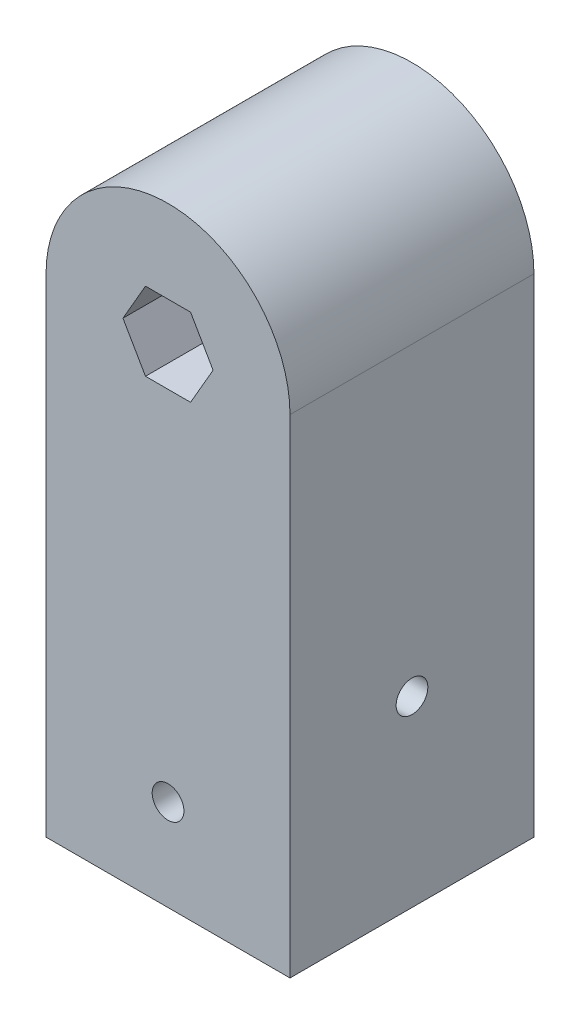
ISO-10303-21;
HEADER;
FILE_DESCRIPTION(('STEP AP214'),'2;1');
FILE_NAME('part.step','',(''),(''),'','','');
FILE_SCHEMA(('AUTOMOTIVE_DESIGN { 1 0 10303 214 1 1 1 1 }'));
ENDSEC;
DATA;
#1=APPLICATION_CONTEXT('core data for automotive mechanical design processes');
#2=APPLICATION_PROTOCOL_DEFINITION('international standard','automotive_design',2000,#1);
#3=PRODUCT_CONTEXT('',#1,'mechanical');
#4=PRODUCT('Part','Part','',(#3));
#5=PRODUCT_RELATED_PRODUCT_CATEGORY('part','',(#4));
#6=PRODUCT_DEFINITION_FORMATION('','',#4);
#7=PRODUCT_DEFINITION_CONTEXT('part definition',#1,'design');
#8=PRODUCT_DEFINITION('design','',#6,#7);
#9=PRODUCT_DEFINITION_SHAPE('','',#8);
#10=(LENGTH_UNIT() NAMED_UNIT(*) SI_UNIT(.MILLI.,.METRE.));
#11=(NAMED_UNIT(*) PLANE_ANGLE_UNIT() SI_UNIT($,.RADIAN.));
#12=(NAMED_UNIT(*) SI_UNIT($,.STERADIAN.) SOLID_ANGLE_UNIT());
#13=UNCERTAINTY_MEASURE_WITH_UNIT(LENGTH_MEASURE(1.E-05),#10,'distance_accuracy_value','');
#14=(GEOMETRIC_REPRESENTATION_CONTEXT(3) GLOBAL_UNCERTAINTY_ASSIGNED_CONTEXT((#13)) GLOBAL_UNIT_ASSIGNED_CONTEXT((#10,
#11,#12)) REPRESENTATION_CONTEXT('',''));
#15=CARTESIAN_POINT('',(0.,0.,0.));
#16=DIRECTION('',(0.,0.,1.));
#17=DIRECTION('',(1.,0.,0.));
#18=AXIS2_PLACEMENT_3D('',#15,#16,#17);
#19=CARTESIAN_POINT('',(0.,0.,10.));
#20=DIRECTION('',(0.,0.,1.));
#21=DIRECTION('',(1.,0.,0.));
#22=AXIS2_PLACEMENT_3D('',#19,#20,#21);
#23=PLANE('',#22);
#24=CARTESIAN_POINT('',(0.,-32.5,10.));
#25=DIRECTION('',(0.,0.,1.));
#26=DIRECTION('',(1.,0.,0.));
#27=AXIS2_PLACEMENT_3D('',#24,#25,#26);
#28=CIRCLE('',#27,1.3);
#29=CARTESIAN_POINT('',(1.3,-32.5,10.));
#30=VERTEX_POINT('',#29);
#31=EDGE_CURVE('E447',#30,#30,#28,.T.);
#32=ORIENTED_EDGE('',*,*,#31,.F.);
#33=EDGE_LOOP('',(#32));
#34=FACE_BOUND('',#33,.T.);
#35=CARTESIAN_POINT('',(0.,0.,10.));
#36=DIRECTION('',(0.,0.,1.));
#37=DIRECTION('',(1.,0.,0.));
#38=AXIS2_PLACEMENT_3D('',#35,#36,#37);
#39=CIRCLE('',#38,10.);
#40=CARTESIAN_POINT('',(10.,0.,10.));
#41=VERTEX_POINT('',#40);
#42=CARTESIAN_POINT('',(-10.,0.,10.));
#43=VERTEX_POINT('',#42);
#44=EDGE_CURVE('E174',#41,#43,#39,.T.);
#45=ORIENTED_EDGE('',*,*,#44,.T.);
#46=DIRECTION('',(0.,-1.,0.));
#47=VECTOR('',#46,1.);
#48=CARTESIAN_POINT('',(-10.,0.,10.));
#49=LINE('',#48,#47);
#50=CARTESIAN_POINT('',(-10.,-40.,10.));
#51=VERTEX_POINT('',#50);
#52=EDGE_CURVE('E177',#43,#51,#49,.T.);
#53=ORIENTED_EDGE('',*,*,#52,.T.);
#54=DIRECTION('',(1.,0.,0.));
#55=VECTOR('',#54,1.);
#56=CARTESIAN_POINT('',(-10.,-40.,10.));
#57=LINE('',#56,#55);
#58=CARTESIAN_POINT('',(10.,-40.,10.));
#59=VERTEX_POINT('',#58);
#60=EDGE_CURVE('E180',#51,#59,#57,.T.);
#61=ORIENTED_EDGE('',*,*,#60,.T.);
#62=DIRECTION('',(0.,1.,0.));
#63=VECTOR('',#62,1.);
#64=CARTESIAN_POINT('',(10.,-40.,10.));
#65=LINE('',#64,#63);
#66=EDGE_CURVE('E182',#59,#41,#65,.T.);
#67=ORIENTED_EDGE('',*,*,#66,.T.);
#68=EDGE_LOOP('',(#45,#53,#61,#67));
#69=FACE_BOUND('',#68,.T.);
#70=DIRECTION('',(-0.500000000000001,0.866025403784438,0.));
#71=VECTOR('',#70,1.);
#72=CARTESIAN_POINT('',(3.69504172281361,0.,10.));
#73=LINE('',#72,#71);
#74=CARTESIAN_POINT('',(3.69504172281361,0.,10.));
#75=VERTEX_POINT('',#74);
#76=CARTESIAN_POINT('',(1.8475208614068,3.20000000000001,10.));
#77=VERTEX_POINT('',#76);
#78=EDGE_CURVE('E129',#75,#77,#73,.T.);
#79=ORIENTED_EDGE('',*,*,#78,.F.);
#80=DIRECTION('',(0.499999999999995,0.866025403784441,0.));
#81=VECTOR('',#80,1.);
#82=CARTESIAN_POINT('',(1.84752086140684,-3.19999999999998,10.));
#83=LINE('',#82,#81);
#84=CARTESIAN_POINT('',(1.84752086140684,-3.19999999999998,10.));
#85=VERTEX_POINT('',#84);
#86=EDGE_CURVE('E121',#85,#75,#83,.T.);
#87=ORIENTED_EDGE('',*,*,#86,.F.);
#88=DIRECTION('',(1.,0.,0.));
#89=VECTOR('',#88,1.);
#90=CARTESIAN_POINT('',(-1.84752086140677,-3.20000000000002,10.));
#91=LINE('',#90,#89);
#92=CARTESIAN_POINT('',(-1.84752086140677,-3.20000000000002,10.));
#93=VERTEX_POINT('',#92);
#94=EDGE_CURVE('E151',#93,#85,#91,.T.);
#95=ORIENTED_EDGE('',*,*,#94,.F.);
#96=DIRECTION('',(0.500000000000007,-0.866025403784434,0.));
#97=VECTOR('',#96,1.);
#98=CARTESIAN_POINT('',(-3.69504172281361,0.,10.));
#99=LINE('',#98,#97);
#100=CARTESIAN_POINT('',(-3.69504172281361,0.,10.));
#101=VERTEX_POINT('',#100);
#102=EDGE_CURVE('E149',#101,#93,#99,.T.);
#103=ORIENTED_EDGE('',*,*,#102,.F.);
#104=DIRECTION('',(-0.499999999999995,-0.866025403784441,0.));
#105=VECTOR('',#104,1.);
#106=CARTESIAN_POINT('',(-1.84752086140682,3.19999999999999,10.));
#107=LINE('',#106,#105);
#108=CARTESIAN_POINT('',(-1.84752086140682,3.19999999999999,10.));
#109=VERTEX_POINT('',#108);
#110=EDGE_CURVE('E144',#109,#101,#107,.T.);
#111=ORIENTED_EDGE('',*,*,#110,.F.);
#112=DIRECTION('',(-1.,0.,0.));
#113=VECTOR('',#112,1.);
#114=CARTESIAN_POINT('',(1.8475208614068,3.20000000000001,10.));
#115=LINE('',#114,#113);
#116=EDGE_CURVE('E142',#77,#109,#115,.T.);
#117=ORIENTED_EDGE('',*,*,#116,.F.);
#118=EDGE_LOOP('',(#79,#87,#95,#103,#111,#117));
#119=FACE_BOUND('',#118,.T.);
#120=ADVANCED_FACE('F37',(#34,#69,#119),#23,.T.);
#121=CARTESIAN_POINT('',(0.,0.,-10.));
#122=DIRECTION('',(0.,0.,1.));
#123=DIRECTION('',(1.,0.,0.));
#124=AXIS2_PLACEMENT_3D('',#121,#122,#123);
#125=PLANE('',#124);
#126=CARTESIAN_POINT('',(0.,-32.5,-10.));
#127=DIRECTION('',(0.,0.,1.));
#128=DIRECTION('',(1.,0.,0.));
#129=AXIS2_PLACEMENT_3D('',#126,#127,#128);
#130=CIRCLE('',#129,1.3);
#131=CARTESIAN_POINT('',(1.3,-32.5,-10.));
#132=VERTEX_POINT('',#131);
#133=EDGE_CURVE('E207',#132,#132,#130,.T.);
#134=ORIENTED_EDGE('',*,*,#133,.T.);
#135=EDGE_LOOP('',(#134));
#136=FACE_BOUND('',#135,.T.);
#137=CARTESIAN_POINT('',(0.,0.,-10.));
#138=DIRECTION('',(0.,0.,1.));
#139=DIRECTION('',(1.,0.,0.));
#140=AXIS2_PLACEMENT_3D('',#137,#138,#139);
#141=CIRCLE('',#140,10.);
#142=CARTESIAN_POINT('',(10.,0.,-10.));
#143=VERTEX_POINT('',#142);
#144=CARTESIAN_POINT('',(-10.,0.,-10.));
#145=VERTEX_POINT('',#144);
#146=EDGE_CURVE('E137',#143,#145,#141,.T.);
#147=ORIENTED_EDGE('',*,*,#146,.F.);
#148=DIRECTION('',(0.,1.,0.));
#149=VECTOR('',#148,1.);
#150=CARTESIAN_POINT('',(10.,-40.,-10.));
#151=LINE('',#150,#149);
#152=CARTESIAN_POINT('',(10.,-40.,-10.));
#153=VERTEX_POINT('',#152);
#154=EDGE_CURVE('E178',#153,#143,#151,.T.);
#155=ORIENTED_EDGE('',*,*,#154,.F.);
#156=DIRECTION('',(1.,0.,0.));
#157=VECTOR('',#156,1.);
#158=CARTESIAN_POINT('',(-10.,-40.,-10.));
#159=LINE('',#158,#157);
#160=CARTESIAN_POINT('',(-10.,-40.,-10.));
#161=VERTEX_POINT('',#160);
#162=EDGE_CURVE('E189',#161,#153,#159,.T.);
#163=ORIENTED_EDGE('',*,*,#162,.F.);
#164=DIRECTION('',(0.,-1.,0.));
#165=VECTOR('',#164,1.);
#166=CARTESIAN_POINT('',(-10.,0.,-10.));
#167=LINE('',#166,#165);
#168=EDGE_CURVE('E187',#145,#161,#167,.T.);
#169=ORIENTED_EDGE('',*,*,#168,.F.);
#170=EDGE_LOOP('',(#147,#155,#163,#169));
#171=FACE_BOUND('',#170,.T.);
#172=DIRECTION('',(0.499999999999995,0.866025403784441,0.));
#173=VECTOR('',#172,1.);
#174=CARTESIAN_POINT('',(1.84752086140684,-3.19999999999998,-10.));
#175=LINE('',#174,#173);
#176=CARTESIAN_POINT('',(1.84752086140684,-3.19999999999998,-10.));
#177=VERTEX_POINT('',#176);
#178=CARTESIAN_POINT('',(3.69504172281361,0.,-10.));
#179=VERTEX_POINT('',#178);
#180=EDGE_CURVE('E67',#177,#179,#175,.T.);
#181=ORIENTED_EDGE('',*,*,#180,.T.);
#182=DIRECTION('',(-0.500000000000001,0.866025403784438,0.));
#183=VECTOR('',#182,1.);
#184=CARTESIAN_POINT('',(3.69504172281361,0.,-10.));
#185=LINE('',#184,#183);
#186=CARTESIAN_POINT('',(1.8475208614068,3.20000000000001,-10.));
#187=VERTEX_POINT('',#186);
#188=EDGE_CURVE('E136',#179,#187,#185,.T.);
#189=ORIENTED_EDGE('',*,*,#188,.T.);
#190=DIRECTION('',(-1.,0.,0.));
#191=VECTOR('',#190,1.);
#192=CARTESIAN_POINT('',(1.8475208614068,3.20000000000001,-10.));
#193=LINE('',#192,#191);
#194=CARTESIAN_POINT('',(-1.84752086140682,3.19999999999999,-10.));
#195=VERTEX_POINT('',#194);
#196=EDGE_CURVE('E156',#187,#195,#193,.T.);
#197=ORIENTED_EDGE('',*,*,#196,.T.);
#198=DIRECTION('',(-0.499999999999995,-0.866025403784441,0.));
#199=VECTOR('',#198,1.);
#200=CARTESIAN_POINT('',(-1.84752086140682,3.19999999999999,-10.));
#201=LINE('',#200,#199);
#202=CARTESIAN_POINT('',(-3.69504172281361,0.,-10.));
#203=VERTEX_POINT('',#202);
#204=EDGE_CURVE('E159',#195,#203,#201,.T.);
#205=ORIENTED_EDGE('',*,*,#204,.T.);
#206=DIRECTION('',(0.500000000000007,-0.866025403784434,0.));
#207=VECTOR('',#206,1.);
#208=CARTESIAN_POINT('',(-3.69504172281361,0.,-10.));
#209=LINE('',#208,#207);
#210=CARTESIAN_POINT('',(-1.84752086140677,-3.20000000000002,-10.));
#211=VERTEX_POINT('',#210);
#212=EDGE_CURVE('E162',#203,#211,#209,.T.);
#213=ORIENTED_EDGE('',*,*,#212,.T.);
#214=DIRECTION('',(1.,0.,0.));
#215=VECTOR('',#214,1.);
#216=CARTESIAN_POINT('',(-1.84752086140677,-3.20000000000002,-10.));
#217=LINE('',#216,#215);
#218=EDGE_CURVE('E130',#211,#177,#217,.T.);
#219=ORIENTED_EDGE('',*,*,#218,.T.);
#220=EDGE_LOOP('',(#181,#189,#197,#205,#213,#219));
#221=FACE_BOUND('',#220,.T.);
#222=ADVANCED_FACE('F236',(#136,#171,#221),#125,.F.);
#223=CARTESIAN_POINT('',(0.,0.,10.));
#224=DIRECTION('',(0.,0.,-1.));
#225=DIRECTION('',(-1.,0.,0.));
#226=AXIS2_PLACEMENT_3D('',#223,#224,#225);
#227=CYLINDRICAL_SURFACE('',#226,10.);
#228=ORIENTED_EDGE('',*,*,#146,.T.);
#229=DIRECTION('',(0.,0.,-1.));
#230=VECTOR('',#229,1.);
#231=CARTESIAN_POINT('',(-10.,0.,10.));
#232=LINE('',#231,#230);
#233=EDGE_CURVE('E11',#43,#145,#232,.T.);
#234=ORIENTED_EDGE('',*,*,#233,.F.);
#235=ORIENTED_EDGE('',*,*,#44,.F.);
#236=DIRECTION('',(0.,0.,-1.));
#237=VECTOR('',#236,1.);
#238=CARTESIAN_POINT('',(10.,0.,10.));
#239=LINE('',#238,#237);
#240=EDGE_CURVE('E184',#41,#143,#239,.T.);
#241=ORIENTED_EDGE('',*,*,#240,.T.);
#242=EDGE_LOOP('',(#228,#234,#235,#241));
#243=FACE_BOUND('',#242,.T.);
#244=ADVANCED_FACE('F39',(#243),#227,.T.);
#245=CARTESIAN_POINT('',(-10.,0.,10.));
#246=DIRECTION('',(1.,0.,0.));
#247=DIRECTION('',(0.,0.,-1.));
#248=AXIS2_PLACEMENT_3D('',#245,#246,#247);
#249=PLANE('',#248);
#250=CARTESIAN_POINT('',(-10.,-25.,0.));
#251=DIRECTION('',(1.,0.,0.));
#252=DIRECTION('',(0.,0.,-1.));
#253=AXIS2_PLACEMENT_3D('',#250,#251,#252);
#254=CIRCLE('',#253,1.3);
#255=CARTESIAN_POINT('',(-10.,-25.,-1.3));
#256=VERTEX_POINT('',#255);
#257=EDGE_CURVE('E266',#256,#256,#254,.T.);
#258=ORIENTED_EDGE('',*,*,#257,.T.);
#259=EDGE_LOOP('',(#258));
#260=FACE_BOUND('',#259,.T.);
#261=ORIENTED_EDGE('',*,*,#168,.T.);
#262=DIRECTION('',(0.,0.,-1.));
#263=VECTOR('',#262,1.);
#264=CARTESIAN_POINT('',(-10.,-40.,10.));
#265=LINE('',#264,#263);
#266=EDGE_CURVE('E51',#51,#161,#265,.T.);
#267=ORIENTED_EDGE('',*,*,#266,.F.);
#268=ORIENTED_EDGE('',*,*,#52,.F.);
#269=ORIENTED_EDGE('',*,*,#233,.T.);
#270=EDGE_LOOP('',(#261,#267,#268,#269));
#271=FACE_BOUND('',#270,.T.);
#272=ADVANCED_FACE('F255',(#260,#271),#249,.F.);
#273=CARTESIAN_POINT('',(-10.,-40.,10.));
#274=DIRECTION('',(0.,1.,0.));
#275=DIRECTION('',(0.,0.,1.));
#276=AXIS2_PLACEMENT_3D('',#273,#274,#275);
#277=PLANE('',#276);
#278=CARTESIAN_POINT('',(0.,-40.,0.));
#279=DIRECTION('',(0.,-1.,0.));
#280=DIRECTION('',(0.,0.,-1.));
#281=AXIS2_PLACEMENT_3D('',#278,#279,#280);
#282=CIRCLE('',#281,4.9);
#283=CARTESIAN_POINT('',(0.,-40.,-4.9));
#284=VERTEX_POINT('',#283);
#285=EDGE_CURVE('E464',#284,#284,#282,.T.);
#286=ORIENTED_EDGE('',*,*,#285,.F.);
#287=EDGE_LOOP('',(#286));
#288=FACE_BOUND('',#287,.T.);
#289=ORIENTED_EDGE('',*,*,#162,.T.);
#290=DIRECTION('',(0.,0.,-1.));
#291=VECTOR('',#290,1.);
#292=CARTESIAN_POINT('',(10.,-40.,10.));
#293=LINE('',#292,#291);
#294=EDGE_CURVE('E194',#59,#153,#293,.T.);
#295=ORIENTED_EDGE('',*,*,#294,.F.);
#296=ORIENTED_EDGE('',*,*,#60,.F.);
#297=ORIENTED_EDGE('',*,*,#266,.T.);
#298=EDGE_LOOP('',(#289,#295,#296,#297));
#299=FACE_BOUND('',#298,.T.);
#300=ADVANCED_FACE('F252',(#288,#299),#277,.F.);
#301=CARTESIAN_POINT('',(10.,-40.,10.));
#302=DIRECTION('',(-1.,0.,0.));
#303=DIRECTION('',(0.,0.,1.));
#304=AXIS2_PLACEMENT_3D('',#301,#302,#303);
#305=PLANE('',#304);
#306=CARTESIAN_POINT('',(10.,-25.,0.));
#307=DIRECTION('',(1.,0.,0.));
#308=DIRECTION('',(0.,0.,-1.));
#309=AXIS2_PLACEMENT_3D('',#306,#307,#308);
#310=CIRCLE('',#309,1.3);
#311=CARTESIAN_POINT('',(10.,-25.,-1.3));
#312=VERTEX_POINT('',#311);
#313=EDGE_CURVE('E454',#312,#312,#310,.T.);
#314=ORIENTED_EDGE('',*,*,#313,.F.);
#315=EDGE_LOOP('',(#314));
#316=FACE_BOUND('',#315,.T.);
#317=ORIENTED_EDGE('',*,*,#154,.T.);
#318=ORIENTED_EDGE('',*,*,#240,.F.);
#319=ORIENTED_EDGE('',*,*,#66,.F.);
#320=ORIENTED_EDGE('',*,*,#294,.T.);
#321=EDGE_LOOP('',(#317,#318,#319,#320));
#322=FACE_BOUND('',#321,.T.);
#323=ADVANCED_FACE('F249',(#316,#322),#305,.F.);
#324=CARTESIAN_POINT('',(1.84752086140684,-3.19999999999998,10.));
#325=DIRECTION('',(-0.866025403784442,0.499999999999995,0.));
#326=DIRECTION('',(-0.499999999999995,-0.866025403784442,0.));
#327=AXIS2_PLACEMENT_3D('',#324,#325,#326);
#328=PLANE('',#327);
#329=ORIENTED_EDGE('',*,*,#180,.F.);
#330=DIRECTION('',(0.,0.,-1.));
#331=VECTOR('',#330,1.);
#332=CARTESIAN_POINT('',(1.84752086140684,-3.19999999999998,10.));
#333=LINE('',#332,#331);
#334=EDGE_CURVE('E125',#85,#177,#333,.T.);
#335=ORIENTED_EDGE('',*,*,#334,.F.);
#336=ORIENTED_EDGE('',*,*,#86,.T.);
#337=DIRECTION('',(0.,0.,-1.));
#338=VECTOR('',#337,1.);
#339=CARTESIAN_POINT('',(3.69504172281361,0.,10.));
#340=LINE('',#339,#338);
#341=EDGE_CURVE('E124',#75,#179,#340,.T.);
#342=ORIENTED_EDGE('',*,*,#341,.T.);
#343=EDGE_LOOP('',(#329,#335,#336,#342));
#344=FACE_BOUND('',#343,.T.);
#345=ADVANCED_FACE('F123',(#344),#328,.T.);
#346=CARTESIAN_POINT('',(3.69504172281361,0.,10.));
#347=DIRECTION('',(-0.866025403784438,-0.500000000000001,0.));
#348=DIRECTION('',(0.500000000000001,-0.866025403784438,0.));
#349=AXIS2_PLACEMENT_3D('',#346,#347,#348);
#350=PLANE('',#349);
#351=ORIENTED_EDGE('',*,*,#188,.F.);
#352=ORIENTED_EDGE('',*,*,#341,.F.);
#353=ORIENTED_EDGE('',*,*,#78,.T.);
#354=DIRECTION('',(0.,0.,-1.));
#355=VECTOR('',#354,1.);
#356=CARTESIAN_POINT('',(1.8475208614068,3.20000000000001,10.));
#357=LINE('',#356,#355);
#358=EDGE_CURVE('E138',#77,#187,#357,.T.);
#359=ORIENTED_EDGE('',*,*,#358,.T.);
#360=EDGE_LOOP('',(#351,#352,#353,#359));
#361=FACE_BOUND('',#360,.T.);
#362=ADVANCED_FACE('F133',(#361),#350,.T.);
#363=CARTESIAN_POINT('',(1.8475208614068,3.20000000000001,10.));
#364=DIRECTION('',(0.,-1.,0.));
#365=DIRECTION('',(1.,0.,0.));
#366=AXIS2_PLACEMENT_3D('',#363,#364,#365);
#367=PLANE('',#366);
#368=ORIENTED_EDGE('',*,*,#196,.F.);
#369=ORIENTED_EDGE('',*,*,#358,.F.);
#370=ORIENTED_EDGE('',*,*,#116,.T.);
#371=DIRECTION('',(0.,0.,-1.));
#372=VECTOR('',#371,1.);
#373=CARTESIAN_POINT('',(-1.84752086140682,3.19999999999999,10.));
#374=LINE('',#373,#372);
#375=EDGE_CURVE('E171',#109,#195,#374,.T.);
#376=ORIENTED_EDGE('',*,*,#375,.T.);
#377=EDGE_LOOP('',(#368,#369,#370,#376));
#378=FACE_BOUND('',#377,.T.);
#379=ADVANCED_FACE('F292',(#378),#367,.T.);
#380=CARTESIAN_POINT('',(-1.84752086140682,3.19999999999999,10.));
#381=DIRECTION('',(0.866025403784442,-0.499999999999995,0.));
#382=DIRECTION('',(0.499999999999995,0.866025403784442,0.));
#383=AXIS2_PLACEMENT_3D('',#380,#381,#382);
#384=PLANE('',#383);
#385=ORIENTED_EDGE('',*,*,#204,.F.);
#386=ORIENTED_EDGE('',*,*,#375,.F.);
#387=ORIENTED_EDGE('',*,*,#110,.T.);
#388=DIRECTION('',(0.,0.,-1.));
#389=VECTOR('',#388,1.);
#390=CARTESIAN_POINT('',(-3.69504172281361,0.,10.));
#391=LINE('',#390,#389);
#392=EDGE_CURVE('E169',#101,#203,#391,.T.);
#393=ORIENTED_EDGE('',*,*,#392,.T.);
#394=EDGE_LOOP('',(#385,#386,#387,#393));
#395=FACE_BOUND('',#394,.T.);
#396=ADVANCED_FACE('F288',(#395),#384,.T.);
#397=CARTESIAN_POINT('',(-3.69504172281361,0.,10.));
#398=DIRECTION('',(0.866025403784435,0.500000000000007,0.));
#399=DIRECTION('',(-0.500000000000007,0.866025403784435,0.));
#400=AXIS2_PLACEMENT_3D('',#397,#398,#399);
#401=PLANE('',#400);
#402=ORIENTED_EDGE('',*,*,#212,.F.);
#403=ORIENTED_EDGE('',*,*,#392,.F.);
#404=ORIENTED_EDGE('',*,*,#102,.T.);
#405=DIRECTION('',(0.,0.,-1.));
#406=VECTOR('',#405,1.);
#407=CARTESIAN_POINT('',(-1.84752086140677,-3.20000000000002,10.));
#408=LINE('',#407,#406);
#409=EDGE_CURVE('E59',#93,#211,#408,.T.);
#410=ORIENTED_EDGE('',*,*,#409,.T.);
#411=EDGE_LOOP('',(#402,#403,#404,#410));
#412=FACE_BOUND('',#411,.T.);
#413=ADVANCED_FACE('F285',(#412),#401,.T.);
#414=CARTESIAN_POINT('',(-1.84752086140677,-3.20000000000002,10.));
#415=DIRECTION('',(0.,1.,0.));
#416=DIRECTION('',(-1.,0.,0.));
#417=AXIS2_PLACEMENT_3D('',#414,#415,#416);
#418=PLANE('',#417);
#419=ORIENTED_EDGE('',*,*,#218,.F.);
#420=ORIENTED_EDGE('',*,*,#409,.F.);
#421=ORIENTED_EDGE('',*,*,#94,.T.);
#422=ORIENTED_EDGE('',*,*,#334,.T.);
#423=EDGE_LOOP('',(#419,#420,#421,#422));
#424=FACE_BOUND('',#423,.T.);
#425=ADVANCED_FACE('F232',(#424),#418,.T.);
#426=CARTESIAN_POINT('',(0.,-20.,0.));
#427=DIRECTION('',(0.,-1.,0.));
#428=DIRECTION('',(0.,0.,-1.));
#429=AXIS2_PLACEMENT_3D('',#426,#427,#428);
#430=CYLINDRICAL_SURFACE('',#429,4.9);
#431=CARTESIAN_POINT('',(-4.72440472440709,-25.,-1.3));
#432=CARTESIAN_POINT('',(-4.72440597879529,-25.0716288374649,-1.29999824519189));
#433=CARTESIAN_POINT('',(-4.72605152625758,-25.1432763174624,-1.29405980471855));
#434=CARTESIAN_POINT('',(-4.73243647116334,-25.2845030733908,-1.27050737076863));
#435=CARTESIAN_POINT('',(-4.73717744139348,-25.3540812791213,-1.25288744184871));
#436=CARTESIAN_POINT('',(-4.74917933644583,-25.4891060736853,-1.20659118113986));
#437=CARTESIAN_POINT('',(-4.75643674106594,-25.5545582839453,-1.17793028820474));
#438=CARTESIAN_POINT('',(-4.77264929793828,-25.6797353354951,-1.11041393007384));
#439=CARTESIAN_POINT('',(-4.78160457712766,-25.7394597480582,-1.07155770256718));
#440=CARTESIAN_POINT('',(-4.80045228668703,-25.8529646571263,-0.983725006611248));
#441=CARTESIAN_POINT('',(-4.81036119714945,-25.9065823429778,-0.934541633403738));
#442=CARTESIAN_POINT('',(-4.82985738049464,-26.0049129421259,-0.827895819434491));
#443=CARTESIAN_POINT('',(-4.8394446202304,-26.0496249400524,-0.770432528667567));
#444=CARTESIAN_POINT('',(-4.85740100549301,-26.1295527961184,-0.647730249822044));
#445=CARTESIAN_POINT('',(-4.86574844238578,-26.1646069557493,-0.582382479183637));
#446=CARTESIAN_POINT('',(-4.88009568953737,-26.2231698011716,-0.446462582001356));
#447=CARTESIAN_POINT('',(-4.88609589144332,-26.2466804132251,-0.375891329358763));
#448=CARTESIAN_POINT('',(-4.89495608023744,-26.2809623123281,-0.23322695783262));
#449=CARTESIAN_POINT('',(-4.89788422000174,-26.2920105119581,-0.161204687103435));
#450=CARTESIAN_POINT('',(-4.90050858363005,-26.3019250180181,-0.0162733874258234));
#451=CARTESIAN_POINT('',(-4.90020534312859,-26.300793343387,0.0566354925567394));
#452=CARTESIAN_POINT('',(-4.89645111509753,-26.2865755761524,0.199343546306893));
#453=CARTESIAN_POINT('',(-4.89307890268424,-26.273788640848,0.269174912902325));
#454=CARTESIAN_POINT('',(-4.88365848859723,-26.237106422131,0.405662832654969));
#455=CARTESIAN_POINT('',(-4.87761013512499,-26.2132105085811,0.472319205479676));
#456=CARTESIAN_POINT('',(-4.86339988718949,-26.1547582976459,0.601330753011591));
#457=CARTESIAN_POINT('',(-4.85521773283929,-26.1200991691542,0.663637013968975));
#458=CARTESIAN_POINT('',(-4.83762197421338,-26.0411832243784,0.781651336574342));
#459=CARTESIAN_POINT('',(-4.82820813216648,-25.9969245538624,0.83735812025931));
#460=CARTESIAN_POINT('',(-4.80883204337707,-25.8984764953042,0.942377662147089));
#461=CARTESIAN_POINT('',(-4.79886182492454,-25.844026146888,0.991444602340364));
#462=CARTESIAN_POINT('',(-4.77975517131629,-25.727566535343,1.07981019636846));
#463=CARTESIAN_POINT('',(-4.77061878595616,-25.6655568212931,1.11910826705839));
#464=CARTESIAN_POINT('',(-4.7541825638699,-25.5352099404017,1.18700520816355));
#465=CARTESIAN_POINT('',(-4.74689417229137,-25.4668367632877,1.21553791222584));
#466=CARTESIAN_POINT('',(-4.73512173514834,-25.3260224022414,1.26062329923625));
#467=CARTESIAN_POINT('',(-4.7306370023001,-25.2535822200363,1.27717891838148));
#468=CARTESIAN_POINT('',(-4.72512590022514,-25.1089874853793,1.29741774477918));
#469=CARTESIAN_POINT('',(-4.72400111979208,-25.0368879136164,1.30146736943717));
#470=CARTESIAN_POINT('',(-4.72506813885581,-24.893041925632,1.29758826151813));
#471=CARTESIAN_POINT('',(-4.7272595894625,-24.8212954730567,1.2896607890135));
#472=CARTESIAN_POINT('',(-4.73461715574152,-24.681599838995,1.26237539985392));
#473=CARTESIAN_POINT('',(-4.73972605436131,-24.613604442357,1.24323716782455));
#474=CARTESIAN_POINT('',(-4.75228710729956,-24.4817885400118,1.194320245671));
#475=CARTESIAN_POINT('',(-4.75973956529317,-24.4179685766468,1.16454017652423));
#476=CARTESIAN_POINT('',(-4.77635046069364,-24.2947805005273,1.09443910798786));
#477=CARTESIAN_POINT('',(-4.78554252563052,-24.235539657332,1.05390261030413));
#478=CARTESIAN_POINT('',(-4.80451752091849,-24.1245665358006,0.963706941333233));
#479=CARTESIAN_POINT('',(-4.81430056094102,-24.0728356572414,0.914046073259255));
#480=CARTESIAN_POINT('',(-4.83369356037648,-23.9768329417651,0.805317621968512));
#481=CARTESIAN_POINT('',(-4.84329058788387,-23.9328164580076,0.746021809651006));
#482=CARTESIAN_POINT('',(-4.86094318785997,-23.855362307637,0.620670118835828));
#483=CARTESIAN_POINT('',(-4.86899884232629,-23.8219240782225,0.554614600226548));
#484=CARTESIAN_POINT('',(-4.88260918805334,-23.766881369734,0.418083279761641));
#485=CARTESIAN_POINT('',(-4.88818244989598,-23.7451887495765,0.347644952561328));
#486=CARTESIAN_POINT('',(-4.89628174932729,-23.7139964866741,0.203953032833442));
#487=CARTESIAN_POINT('',(-4.89880845481241,-23.7044941714198,0.130700060995306));
#488=CARTESIAN_POINT('',(-4.90049876982262,-23.6981182616764,-0.0141550424992418));
#489=CARTESIAN_POINT('',(-4.89976218278931,-23.7008699096984,-0.0857397491381221));
#490=CARTESIAN_POINT('',(-4.89523400966711,-23.7180546535662,-0.227388962270794));
#491=CARTESIAN_POINT('',(-4.89144253620665,-23.7324873187531,-0.297453524711904));
#492=CARTESIAN_POINT('',(-4.88125005242802,-23.7724133860854,-0.433627672930736));
#493=CARTESIAN_POINT('',(-4.87486683645702,-23.7978314401071,-0.499760770654063));
#494=CARTESIAN_POINT('',(-4.86015873157812,-23.858939418635,-0.626861256501444));
#495=CARTESIAN_POINT('',(-4.85183357255339,-23.8946307722796,-0.687827924385153));
#496=CARTESIAN_POINT('',(-4.83385816887867,-23.9763728916656,-0.804612379614884));
#497=CARTESIAN_POINT('',(-4.82417870776795,-24.0226726198706,-0.860251400003425));
#498=CARTESIAN_POINT('',(-4.80470494043123,-24.1238440896631,-0.963097083593482));
#499=CARTESIAN_POINT('',(-4.79491060474889,-24.1787180763823,-1.01030153128045));
#500=CARTESIAN_POINT('',(-4.77607147728001,-24.2969134120601,-1.0959517960325));
#501=CARTESIAN_POINT('',(-4.76704756877555,-24.3603922607937,-1.13418526635955));
#502=CARTESIAN_POINT('',(-4.7510646680364,-24.493108482272,-1.19938270188334));
#503=CARTESIAN_POINT('',(-4.74410431311661,-24.5623420160074,-1.22635410890742));
#504=CARTESIAN_POINT('',(-4.73401326709619,-24.6927765065245,-1.26469004578469));
#505=CARTESIAN_POINT('',(-4.73043904248279,-24.7534069135232,-1.27790038021369));
#506=CARTESIAN_POINT('',(-4.72563435880108,-24.8760203260068,-1.29555562861845));
#507=CARTESIAN_POINT('',(-4.724403638698,-24.9380031800694,-1.30000151883691));
#508=CARTESIAN_POINT('',(-4.72440472440709,-25.,-1.3));
#509=B_SPLINE_CURVE_WITH_KNOTS('',3,(#431,#432,#433,#434,#435,#436,#437,#438,#439,#440,#441,
#442,#443,#444,#445,#446,#447,#448,#449,#450,#451,#452,#453,#454,#455,#456,#457,#458,#459,#460,
#461,#462,#463,#464,#465,#466,#467,#468,#469,#470,#471,#472,#473,#474,#475,#476,#477,#478,#479,
#480,#481,#482,#483,#484,#485,#486,#487,#488,#489,#490,#491,#492,#493,#494,#495,#496,#497,#498,
#499,#500,#501,#502,#503,#504,#505,#506,#507,#508),.UNSPECIFIED.,.T.,.F.,(4,2,2,2,2,2,2,2,2,2,2,
2,2,2,2,2,2,2,2,2,2,2,2,2,2,2,2,2,2,2,2,2,2,2,2,2,2,2,4),(0.,0.214658565987897,0.42942628512356,
0.643894772991055,0.858379301359446,1.07766080668804,1.29696483922016,1.51974387676817,
1.7424857267205,1.96017430053207,2.17782679078507,2.39004540655089,2.6022760615188,
2.81660020375821,3.03096578142489,3.25184714454485,3.4727416898377,3.6949726033182,
3.917149018138,4.13275089078561,4.34833008222368,4.5598198041611,4.77133694194114,
4.98746191968528,5.20362712923148,5.42596866186901,5.64829836314231,5.86893568931795,
6.08952463637949,6.30341452453717,6.5172965273016,6.72973424581866,6.94220153124586,
7.16028671479648,7.3784290989778,7.6013063103021,7.82403601325705,8.00984987724158,
8.19564304285918),.UNSPECIFIED.);
#510=CARTESIAN_POINT('',(-4.72440472440709,-25.,-1.3));
#511=VERTEX_POINT('',#510);
#512=EDGE_CURVE('E41',#511,#511,#509,.T.);
#513=ORIENTED_EDGE('',*,*,#512,.T.);
#514=EDGE_LOOP('',(#513));
#515=FACE_BOUND('',#514,.T.);
#516=CARTESIAN_POINT('',(4.72440472440709,-25.,-1.3));
#517=CARTESIAN_POINT('',(4.72440597879529,-24.9283711625351,-1.29999824519189));
#518=CARTESIAN_POINT('',(4.72605152625758,-24.8567236825376,-1.29405980471855));
#519=CARTESIAN_POINT('',(4.73243647116334,-24.7154969266092,-1.27050737076863));
#520=CARTESIAN_POINT('',(4.73717744139348,-24.6459187208787,-1.25288744184871));
#521=CARTESIAN_POINT('',(4.74917933644583,-24.5108939263147,-1.20659118113986));
#522=CARTESIAN_POINT('',(4.75643674106594,-24.4454417160547,-1.17793028820474));
#523=CARTESIAN_POINT('',(4.77264929793828,-24.3202646645049,-1.11041393007384));
#524=CARTESIAN_POINT('',(4.78160457712766,-24.2605402519418,-1.07155770256718));
#525=CARTESIAN_POINT('',(4.80045228668703,-24.1470353428737,-0.983725006611248));
#526=CARTESIAN_POINT('',(4.81036119714945,-24.0934176570222,-0.934541633403738));
#527=CARTESIAN_POINT('',(4.82985738049464,-23.9950870578741,-0.827895819434491));
#528=CARTESIAN_POINT('',(4.8394446202304,-23.9503750599476,-0.770432528667567));
#529=CARTESIAN_POINT('',(4.85740100549301,-23.8704472038816,-0.647730249822044));
#530=CARTESIAN_POINT('',(4.86574844238578,-23.8353930442507,-0.582382479183637));
#531=CARTESIAN_POINT('',(4.88009568953737,-23.7768301988284,-0.446462582001356));
#532=CARTESIAN_POINT('',(4.88609589144332,-23.7533195867749,-0.375891329358763));
#533=CARTESIAN_POINT('',(4.89495608023744,-23.7190376876719,-0.23322695783262));
#534=CARTESIAN_POINT('',(4.89788422000174,-23.7079894880419,-0.161204687103435));
#535=CARTESIAN_POINT('',(4.90050858363005,-23.698074981982,-0.0162733874258234));
#536=CARTESIAN_POINT('',(4.90020534312859,-23.699206656613,0.0566354925567395));
#537=CARTESIAN_POINT('',(4.89645111509753,-23.7134244238476,0.199343546306893));
#538=CARTESIAN_POINT('',(4.89307890268424,-23.726211359152,0.269174912902324));
#539=CARTESIAN_POINT('',(4.88365848859723,-23.762893577869,0.405662832654967));
#540=CARTESIAN_POINT('',(4.87761013512499,-23.7867894914189,0.472319205479676));
#541=CARTESIAN_POINT('',(4.86339988718949,-23.8452417023541,0.601330753011591));
#542=CARTESIAN_POINT('',(4.85521773283929,-23.8799008308458,0.663637013968975));
#543=CARTESIAN_POINT('',(4.83762197421338,-23.9588167756216,0.781651336574342));
#544=CARTESIAN_POINT('',(4.82820813216648,-24.0030754461376,0.83735812025931));
#545=CARTESIAN_POINT('',(4.80883204337707,-24.1015235046958,0.942377662147087));
#546=CARTESIAN_POINT('',(4.79886182492454,-24.155973853112,0.991444602340362));
#547=CARTESIAN_POINT('',(4.77975517131629,-24.272433464657,1.07981019636846));
#548=CARTESIAN_POINT('',(4.77061878595616,-24.3344431787069,1.11910826705838));
#549=CARTESIAN_POINT('',(4.7541825638699,-24.4647900595983,1.18700520816355));
#550=CARTESIAN_POINT('',(4.74689417229137,-24.5331632367123,1.21553791222584));
#551=CARTESIAN_POINT('',(4.73512173514834,-24.6739775977586,1.26062329923625));
#552=CARTESIAN_POINT('',(4.7306370023001,-24.7464177799637,1.27717891838148));
#553=CARTESIAN_POINT('',(4.72512590022514,-24.8910125146207,1.29741774477918));
#554=CARTESIAN_POINT('',(4.72400111979208,-24.9631120863836,1.30146736943717));
#555=CARTESIAN_POINT('',(4.72506813885581,-25.106958074368,1.29758826151813));
#556=CARTESIAN_POINT('',(4.7272595894625,-25.1787045269433,1.2896607890135));
#557=CARTESIAN_POINT('',(4.73461715574152,-25.318400161005,1.26237539985392));
#558=CARTESIAN_POINT('',(4.73972605436131,-25.386395557643,1.24323716782454));
#559=CARTESIAN_POINT('',(4.75228710729956,-25.5182114599882,1.194320245671));
#560=CARTESIAN_POINT('',(4.75973956529317,-25.5820314233532,1.16454017652423));
#561=CARTESIAN_POINT('',(4.77635046069363,-25.7052194994727,1.09443910798786));
#562=CARTESIAN_POINT('',(4.78554252563052,-25.764460342668,1.05390261030413));
#563=CARTESIAN_POINT('',(4.80451752091849,-25.8754334641994,0.963706941333233));
#564=CARTESIAN_POINT('',(4.81430056094102,-25.9271643427586,0.914046073259255));
#565=CARTESIAN_POINT('',(4.83369356037648,-26.0231670582349,0.805317621968512));
#566=CARTESIAN_POINT('',(4.84329058788387,-26.0671835419924,0.746021809651006));
#567=CARTESIAN_POINT('',(4.86094318785997,-26.144637692363,0.620670118835828));
#568=CARTESIAN_POINT('',(4.86899884232629,-26.1780759217775,0.554614600226548));
#569=CARTESIAN_POINT('',(4.88260918805334,-26.233118630266,0.418083279761641));
#570=CARTESIAN_POINT('',(4.88818244989598,-26.2548112504235,0.347644952561328));
#571=CARTESIAN_POINT('',(4.89628174932729,-26.2860035133259,0.203953032833442));
#572=CARTESIAN_POINT('',(4.89880845481241,-26.2955058285802,0.130700060995306));
#573=CARTESIAN_POINT('',(4.90049876982262,-26.3018817383236,-0.014155042499242));
#574=CARTESIAN_POINT('',(4.89976218278931,-26.2991300903016,-0.0857397491381224));
#575=CARTESIAN_POINT('',(4.89523400966711,-26.2819453464338,-0.227388962270794));
#576=CARTESIAN_POINT('',(4.89144253620665,-26.2675126812469,-0.297453524711904));
#577=CARTESIAN_POINT('',(4.88125005242802,-26.2275866139146,-0.433627672930736));
#578=CARTESIAN_POINT('',(4.87486683645702,-26.2021685598929,-0.499760770654063));
#579=CARTESIAN_POINT('',(4.86015873157812,-26.141060581365,-0.626861256501445));
#580=CARTESIAN_POINT('',(4.85183357255339,-26.1053692277204,-0.687827924385153));
#581=CARTESIAN_POINT('',(4.83385816887867,-26.0236271083344,-0.804612379614885));
#582=CARTESIAN_POINT('',(4.82417870776795,-25.9773273801294,-0.860251400003426));
#583=CARTESIAN_POINT('',(4.80470494043123,-25.8761559103369,-0.963097083593482));
#584=CARTESIAN_POINT('',(4.79491060474889,-25.8212819236177,-1.01030153128045));
#585=CARTESIAN_POINT('',(4.77607147728001,-25.7030865879399,-1.0959517960325));
#586=CARTESIAN_POINT('',(4.76704756877555,-25.6396077392063,-1.13418526635955));
#587=CARTESIAN_POINT('',(4.7510646680364,-25.506891517728,-1.19938270188334));
#588=CARTESIAN_POINT('',(4.74410431311661,-25.4376579839926,-1.22635410890742));
#589=CARTESIAN_POINT('',(4.73401326709619,-25.3072234934755,-1.26469004578469));
#590=CARTESIAN_POINT('',(4.73043904248279,-25.2465930864768,-1.27790038021369));
#591=CARTESIAN_POINT('',(4.72563435880108,-25.1239796739932,-1.29555562861845));
#592=CARTESIAN_POINT('',(4.724403638698,-25.0619968199306,-1.30000151883691));
#593=CARTESIAN_POINT('',(4.72440472440709,-25.,-1.3));
#594=B_SPLINE_CURVE_WITH_KNOTS('',3,(#516,#517,#518,#519,#520,#521,#522,#523,#524,#525,#526,
#527,#528,#529,#530,#531,#532,#533,#534,#535,#536,#537,#538,#539,#540,#541,#542,#543,#544,#545,
#546,#547,#548,#549,#550,#551,#552,#553,#554,#555,#556,#557,#558,#559,#560,#561,#562,#563,#564,
#565,#566,#567,#568,#569,#570,#571,#572,#573,#574,#575,#576,#577,#578,#579,#580,#581,#582,#583,
#584,#585,#586,#587,#588,#589,#590,#591,#592,#593),.UNSPECIFIED.,.T.,.F.,(4,2,2,2,2,2,2,2,2,2,2,
2,2,2,2,2,2,2,2,2,2,2,2,2,2,2,2,2,2,2,2,2,2,2,2,2,2,2,4),(0.,0.214658565987897,0.42942628512356,
0.643894772991055,0.858379301359446,1.07766080668804,1.29696483922016,1.51974387676817,
1.7424857267205,1.96017430053207,2.17782679078507,2.39004540655088,2.6022760615188,
2.81660020375821,3.03096578142489,3.25184714454485,3.4727416898377,3.69497260331819,
3.917149018138,4.13275089078561,4.34833008222368,4.55981980416111,4.77133694194114,
4.98746191968528,5.20362712923148,5.42596866186901,5.64829836314231,5.86893568931795,
6.08952463637949,6.30341452453717,6.5172965273016,6.72973424581866,6.94220153124587,
7.16028671479648,7.3784290989778,7.6013063103021,7.82403601325705,8.00984987724158,
8.19564304285918),.UNSPECIFIED.);
#595=CARTESIAN_POINT('',(4.72440472440709,-25.,-1.3));
#596=VERTEX_POINT('',#595);
#597=EDGE_CURVE('E448',#596,#596,#594,.T.);
#598=ORIENTED_EDGE('',*,*,#597,.T.);
#599=EDGE_LOOP('',(#598));
#600=FACE_BOUND('',#599,.T.);
#601=CARTESIAN_POINT('',(0.,-31.2,-4.9));
#602=CARTESIAN_POINT('',(0.0716789124615698,-31.2000017290044,-4.89999890659966));
#603=CARTESIAN_POINT('',(0.143376417565139,-31.2059481879687,-4.89841168966726));
#604=CARTESIAN_POINT('',(0.28470691319519,-31.2295353534424,-4.8922340842695));
#605=CARTESIAN_POINT('',(0.354338878088377,-31.2471817712198,-4.88764222912152));
#606=CARTESIAN_POINT('',(0.489477742276466,-31.2935554288843,-4.87596230562889));
#607=CARTESIAN_POINT('',(0.554989805020406,-31.3222684635954,-4.8688774383401));
#608=CARTESIAN_POINT('',(0.680268399786178,-31.3899078614392,-4.85296071956209));
#609=CARTESIAN_POINT('',(0.740034564130029,-31.4288348775674,-4.84412875638724));
#610=CARTESIAN_POINT('',(0.853497664497194,-31.5167413157383,-4.82544499743418));
#611=CARTESIAN_POINT('',(0.907043810410058,-31.5659116957881,-4.81557591018588));
#612=CARTESIAN_POINT('',(1.00523482460359,-31.6725008319857,-4.79604156162607));
#613=CARTESIAN_POINT('',(1.04987855927211,-31.7299206369964,-4.78637632641255));
#614=CARTESIAN_POINT('',(1.12973052710978,-31.8525795591821,-4.76816735153549));
#615=CARTESIAN_POINT('',(1.16476568960431,-31.917934884487,-4.75964543945401));
#616=CARTESIAN_POINT('',(1.2232913899384,-32.0538708800773,-4.74494205245865));
#617=CARTESIAN_POINT('',(1.24678403244666,-32.1244505950421,-4.73876015091334));
#618=CARTESIAN_POINT('',(1.28103491021085,-32.2671628814631,-4.72961518032442));
#619=CARTESIAN_POINT('',(1.292066347895,-32.3392253600046,-4.72658317689771));
#620=CARTESIAN_POINT('',(1.30193335725361,-32.4842370223671,-4.72387530721544));
#621=CARTESIAN_POINT('',(1.3007711826633,-32.5571860398402,-4.72419882076233));
#622=CARTESIAN_POINT('',(1.28650094334496,-32.6997708459907,-4.72810371375476));
#623=CARTESIAN_POINT('',(1.2737230394984,-32.7694425356517,-4.73159504721228));
#624=CARTESIAN_POINT('',(1.23711267719533,-32.9056159832682,-4.74129807020241));
#625=CARTESIAN_POINT('',(1.21327934324746,-32.9721174897133,-4.74750997517781));
#626=CARTESIAN_POINT('',(1.15496459624945,-33.1009255110855,-4.76203368611942));
#627=CARTESIAN_POINT('',(1.12036709591435,-33.1631768021704,-4.77036819655981));
#628=CARTESIAN_POINT('',(1.04158711589411,-33.281106406498,-4.78818577283357));
#629=CARTESIAN_POINT('',(0.997402766805357,-33.3367834345068,-4.79766906251554));
#630=CARTESIAN_POINT('',(0.899013335969515,-33.4418708663133,-4.81709084844776));
#631=CARTESIAN_POINT('',(0.844530888059891,-33.4910210548578,-4.82703415857415));
#632=CARTESIAN_POINT('',(0.727975577844363,-33.5795400803646,-4.84598105980781));
#633=CARTESIAN_POINT('',(0.665902422528389,-33.618908539563,-4.85498461461455));
#634=CARTESIAN_POINT('',(0.535527414543698,-33.6868595387494,-4.87109200322241));
#635=CARTESIAN_POINT('',(0.467200142539483,-33.7153953937155,-4.8781875768093));
#636=CARTESIAN_POINT('',(0.326486991036958,-33.7605005522408,-4.88961978913471));
#637=CARTESIAN_POINT('',(0.254101992739979,-33.7770724432037,-4.893957024385));
#638=CARTESIAN_POINT('',(0.109549200976159,-33.797371623466,-4.89929382368712));
#639=CARTESIAN_POINT('',(0.0374344138645521,-33.8014527447041,-4.90038530562436));
#640=CARTESIAN_POINT('',(-0.106449052954899,-33.7976311284726,-4.89937168013188));
#641=CARTESIAN_POINT('',(-0.178217767292394,-33.7897296160977,-4.89726689948544));
#642=CARTESIAN_POINT('',(-0.318111755273602,-33.7624573740814,-4.89015657537891));
#643=CARTESIAN_POINT('',(-0.386278198820944,-33.7432836374689,-4.88520088550609));
#644=CARTESIAN_POINT('',(-0.518420734695109,-33.6942396629385,-4.87295057065112));
#645=CARTESIAN_POINT('',(-0.582396374442058,-33.664368271988,-4.86565569355162));
#646=CARTESIAN_POINT('',(-0.705718889113283,-33.5941181568653,-4.84932040784509));
#647=CARTESIAN_POINT('',(-0.764951609260551,-33.5535464663941,-4.84024882410477));
#648=CARTESIAN_POINT('',(-0.875892442344976,-33.4632903636589,-4.82140894261165));
#649=CARTESIAN_POINT('',(-0.927599081130781,-33.4136041704121,-4.81164050892206));
#650=CARTESIAN_POINT('',(-1.02350824186531,-33.3048789166085,-4.79217031180399));
#651=CARTESIAN_POINT('',(-1.0674612339896,-33.2456176404926,-4.78247800737659));
#652=CARTESIAN_POINT('',(-1.14480367445221,-33.1203559957708,-4.76455734276841));
#653=CARTESIAN_POINT('',(-1.17819356692597,-33.0543559106588,-4.75632892104367));
#654=CARTESIAN_POINT('',(-1.23321064980285,-32.9178220099231,-4.74236202393623));
#655=CARTESIAN_POINT('',(-1.25490615456886,-32.8473172766283,-4.73660912815311));
#656=CARTESIAN_POINT('',(-1.28608187090408,-32.703482011618,-4.72824057364318));
#657=CARTESIAN_POINT('',(-1.29556516544496,-32.6301521979101,-4.72562412313249));
#658=CARTESIAN_POINT('',(-1.3018712672299,-32.4853016994518,-4.72389036602811));
#659=CARTESIAN_POINT('',(-1.29909494189998,-32.4137995299761,-4.72466226166416));
#660=CARTESIAN_POINT('',(-1.28188944433706,-32.2723221528023,-4.7293590847367));
#661=CARTESIAN_POINT('',(-1.26746056620142,-32.2023469066121,-4.73328393259621));
#662=CARTESIAN_POINT('',(-1.22759085265831,-32.0664084829171,-4.74377882524056));
#663=CARTESIAN_POINT('',(-1.20223414269282,-32.0004189602587,-4.75032863588384));
#664=CARTESIAN_POINT('',(-1.14129397195902,-31.8735810502071,-4.76533613222307));
#665=CARTESIAN_POINT('',(-1.10570892201222,-31.8127334636197,-4.77379411434791));
#666=CARTESIAN_POINT('',(-1.02410377327732,-31.6959912227945,-4.79197292457858));
#667=CARTESIAN_POINT('',(-0.977809734001053,-31.6402926462671,-4.80172337736013));
#668=CARTESIAN_POINT('',(-0.876622791378837,-31.5373242959383,-4.82122211799065));
#669=CARTESIAN_POINT('',(-0.82172780466213,-31.4900565702532,-4.83097040474055));
#670=CARTESIAN_POINT('',(-0.703498944330511,-31.4043115370678,-4.84961246666557));
#671=CARTESIAN_POINT('',(-0.640011394692227,-31.3660408488958,-4.85848386017441));
#672=CARTESIAN_POINT('',(-0.507270813794624,-31.3007760159127,-4.87412851037368));
#673=CARTESIAN_POINT('',(-0.43802155361219,-31.2737745638715,-4.88090312592397));
#674=CARTESIAN_POINT('',(-0.30751496958363,-31.2353774883535,-4.89070426368959));
#675=CARTESIAN_POINT('',(-0.24682529846546,-31.2221415624047,-4.89416488524327));
#676=CARTESIAN_POINT('',(-0.124094975801822,-31.2044524940457,-4.89881311689733));
#677=CARTESIAN_POINT('',(-0.0620544553568821,-31.1999985031521,-4.9000009465875));
#678=CARTESIAN_POINT('',(0.,-31.2,-4.9));
#679=B_SPLINE_CURVE_WITH_KNOTS('',3,(#601,#602,#603,#604,#605,#606,#607,#608,#609,#610,#611,
#612,#613,#614,#615,#616,#617,#618,#619,#620,#621,#622,#623,#624,#625,#626,#627,#628,#629,#630,
#631,#632,#633,#634,#635,#636,#637,#638,#639,#640,#641,#642,#643,#644,#645,#646,#647,#648,#649,
#650,#651,#652,#653,#654,#655,#656,#657,#658,#659,#660,#661,#662,#663,#664,#665,#666,#667,#668,
#669,#670,#671,#672,#673,#674,#675,#676,#677,#678),.UNSPECIFIED.,.T.,.F.,(4,2,2,2,2,2,2,2,2,2,2,
2,2,2,2,2,2,2,2,2,2,2,2,2,2,2,2,2,2,2,2,2,2,2,2,2,2,2,4),(0.,0.214809181427462,
0.429723298004203,0.64436246335981,0.859015354269745,1.07810019650763,1.29721291870508,
1.52004585800114,1.74283815073756,1.96064486642635,2.17841132579019,2.39017524552612,
2.60195593793744,2.81610477285454,3.03029540367099,3.25139822367713,3.47250958120313,
3.69456332170286,3.91656902503735,4.13222477789558,4.3478584837709,4.55983132542331,
4.7718270211689,4.98794374416144,5.20410274164588,5.42629082739964,5.64846956980507,
5.86933595820499,6.09014657796176,6.30379151645372,6.51743106295595,6.72945453602275,
6.94151096902662,7.15974875148116,7.37803947870063,7.60093811238521,7.82369198810712,
8.00967632268147,8.19564268714446),.UNSPECIFIED.);
#680=CARTESIAN_POINT('',(0.,-31.2,-4.9));
#681=VERTEX_POINT('',#680);
#682=EDGE_CURVE('E206',#681,#681,#679,.T.);
#683=ORIENTED_EDGE('',*,*,#682,.T.);
#684=EDGE_LOOP('',(#683));
#685=FACE_BOUND('',#684,.T.);
#686=CARTESIAN_POINT('',(1.3,-32.5,4.72440472440709));
#687=CARTESIAN_POINT('',(1.29999824519189,-32.4283711625351,4.72440597879529));
#688=CARTESIAN_POINT('',(1.29405980471855,-32.3567236825376,4.72605152625758));
#689=CARTESIAN_POINT('',(1.27050737076863,-32.2154969266092,4.73243647116334));
#690=CARTESIAN_POINT('',(1.25288744184872,-32.1459187208787,4.73717744139348));
#691=CARTESIAN_POINT('',(1.20659118113986,-32.0108939263147,4.74917933644583));
#692=CARTESIAN_POINT('',(1.17793028820475,-31.9454417160547,4.75643674106594));
#693=CARTESIAN_POINT('',(1.11041393007384,-31.8202646645049,4.77264929793828));
#694=CARTESIAN_POINT('',(1.07155770256718,-31.7605402519418,4.78160457712766));
#695=CARTESIAN_POINT('',(0.983725006611249,-31.6470353428737,4.80045228668703));
#696=CARTESIAN_POINT('',(0.934541633403739,-31.5934176570222,4.81036119714945));
#697=CARTESIAN_POINT('',(0.827895819434492,-31.4950870578741,4.82985738049464));
#698=CARTESIAN_POINT('',(0.770432528667569,-31.4503750599477,4.8394446202304));
#699=CARTESIAN_POINT('',(0.647730249822046,-31.3704472038816,4.85740100549301));
#700=CARTESIAN_POINT('',(0.582382479183637,-31.3353930442507,4.86574844238578));
#701=CARTESIAN_POINT('',(0.446462582001354,-31.2768301988284,4.88009568953737));
#702=CARTESIAN_POINT('',(0.375891329358761,-31.2533195867749,4.88609589144332));
#703=CARTESIAN_POINT('',(0.233226957832616,-31.2190376876719,4.89495608023744));
#704=CARTESIAN_POINT('',(0.161204687103431,-31.2079894880419,4.89788422000174));
#705=CARTESIAN_POINT('',(0.0162733874258199,-31.198074981982,4.90050858363005));
#706=CARTESIAN_POINT('',(-0.0566354925567427,-31.199206656613,4.90020534312859));
#707=CARTESIAN_POINT('',(-0.199343546306896,-31.2134244238476,4.89645111509753));
#708=CARTESIAN_POINT('',(-0.269174912902328,-31.226211359152,4.89307890268424));
#709=CARTESIAN_POINT('',(-0.405662832654972,-31.262893577869,4.88365848859723));
#710=CARTESIAN_POINT('',(-0.472319205479679,-31.2867894914189,4.87761013512499));
#711=CARTESIAN_POINT('',(-0.601330753011594,-31.3452417023541,4.86339988718949));
#712=CARTESIAN_POINT('',(-0.66363701396898,-31.3799008308458,4.85521773283928));
#713=CARTESIAN_POINT('',(-0.781651336574346,-31.4588167756216,4.83762197421338));
#714=CARTESIAN_POINT('',(-0.837358120259314,-31.5030754461376,4.82820813216647));
#715=CARTESIAN_POINT('',(-0.942377662147091,-31.6015235046958,4.80883204337707));
#716=CARTESIAN_POINT('',(-0.991444602340367,-31.655973853112,4.79886182492454));
#717=CARTESIAN_POINT('',(-1.07981019636847,-31.772433464657,4.77975517131629));
#718=CARTESIAN_POINT('',(-1.11910826705839,-31.8344431787069,4.77061878595616));
#719=CARTESIAN_POINT('',(-1.18700520816355,-31.9647900595983,4.7541825638699));
#720=CARTESIAN_POINT('',(-1.21553791222585,-32.0331632367124,4.74689417229137));
#721=CARTESIAN_POINT('',(-1.26062329923625,-32.1739775977586,4.73512173514834));
#722=CARTESIAN_POINT('',(-1.27717891838148,-32.2464177799637,4.7306370023001));
#723=CARTESIAN_POINT('',(-1.29741774477918,-32.3910125146207,4.72512590022514));
#724=CARTESIAN_POINT('',(-1.30146736943717,-32.4631120863836,4.72400111979208));
#725=CARTESIAN_POINT('',(-1.29758826151813,-32.606958074368,4.72506813885581));
#726=CARTESIAN_POINT('',(-1.2896607890135,-32.6787045269434,4.7272595894625));
#727=CARTESIAN_POINT('',(-1.26237539985392,-32.818400161005,4.73461715574152));
#728=CARTESIAN_POINT('',(-1.24323716782454,-32.886395557643,4.73972605436131));
#729=CARTESIAN_POINT('',(-1.19432024567099,-33.0182114599882,4.75228710729956));
#730=CARTESIAN_POINT('',(-1.16454017652422,-33.0820314233532,4.75973956529317));
#731=CARTESIAN_POINT('',(-1.09443910798786,-33.2052194994728,4.77635046069364));
#732=CARTESIAN_POINT('',(-1.05390261030412,-33.264460342668,4.78554252563052));
#733=CARTESIAN_POINT('',(-0.963706941333225,-33.3754334641994,4.80451752091849));
#734=CARTESIAN_POINT('',(-0.914046073259247,-33.4271643427586,4.81430056094102));
#735=CARTESIAN_POINT('',(-0.805317621968506,-33.5231670582349,4.83369356037648));
#736=CARTESIAN_POINT('',(-0.746021809651003,-33.5671835419924,4.84329058788387));
#737=CARTESIAN_POINT('',(-0.620670118835826,-33.644637692363,4.86094318785997));
#738=CARTESIAN_POINT('',(-0.554614600226545,-33.6780759217775,4.86899884232629));
#739=CARTESIAN_POINT('',(-0.418083279761638,-33.733118630266,4.88260918805334));
#740=CARTESIAN_POINT('',(-0.347644952561325,-33.7548112504235,4.88818244989598));
#741=CARTESIAN_POINT('',(-0.203953032833439,-33.7860035133259,4.89628174932729));
#742=CARTESIAN_POINT('',(-0.130700060995303,-33.7955058285802,4.89880845481241));
#743=CARTESIAN_POINT('',(0.0141550424992448,-33.8018817383236,4.90049876982262));
#744=CARTESIAN_POINT('',(0.0857397491381246,-33.7991300903016,4.89976218278931));
#745=CARTESIAN_POINT('',(0.227388962270797,-33.7819453464338,4.89523400966711));
#746=CARTESIAN_POINT('',(0.297453524711907,-33.7675126812469,4.89144253620665));
#747=CARTESIAN_POINT('',(0.43362767293074,-33.7275866139146,4.88125005242802));
#748=CARTESIAN_POINT('',(0.499760770654066,-33.7021685598929,4.87486683645702));
#749=CARTESIAN_POINT('',(0.626861256501448,-33.641060581365,4.86015873157812));
#750=CARTESIAN_POINT('',(0.687827924385157,-33.6053692277204,4.85183357255339));
#751=CARTESIAN_POINT('',(0.804612379614888,-33.5236271083344,4.83385816887867));
#752=CARTESIAN_POINT('',(0.860251400003427,-33.4773273801294,4.82417870776795));
#753=CARTESIAN_POINT('',(0.963097083593484,-33.3761559103369,4.80470494043123));
#754=CARTESIAN_POINT('',(1.01030153128046,-33.3212819236177,4.79491060474889));
#755=CARTESIAN_POINT('',(1.0959517960325,-33.2030865879399,4.77607147728002));
#756=CARTESIAN_POINT('',(1.13418526635955,-33.1396077392063,4.76704756877555));
#757=CARTESIAN_POINT('',(1.19938270188334,-33.006891517728,4.7510646680364));
#758=CARTESIAN_POINT('',(1.22635410890742,-32.9376579839926,4.74410431311661));
#759=CARTESIAN_POINT('',(1.26469004578469,-32.8072234934755,4.73401326709619));
#760=CARTESIAN_POINT('',(1.27790038021369,-32.7465930864768,4.73043904248279));
#761=CARTESIAN_POINT('',(1.29555562861845,-32.6239796739932,4.72563435880108));
#762=CARTESIAN_POINT('',(1.30000151883692,-32.5619968199306,4.724403638698));
#763=CARTESIAN_POINT('',(1.3,-32.5,4.72440472440709));
#764=B_SPLINE_CURVE_WITH_KNOTS('',3,(#686,#687,#688,#689,#690,#691,#692,#693,#694,#695,#696,
#697,#698,#699,#700,#701,#702,#703,#704,#705,#706,#707,#708,#709,#710,#711,#712,#713,#714,#715,
#716,#717,#718,#719,#720,#721,#722,#723,#724,#725,#726,#727,#728,#729,#730,#731,#732,#733,#734,
#735,#736,#737,#738,#739,#740,#741,#742,#743,#744,#745,#746,#747,#748,#749,#750,#751,#752,#753,
#754,#755,#756,#757,#758,#759,#760,#761,#762,#763),.UNSPECIFIED.,.T.,.F.,(4,2,2,2,2,2,2,2,2,2,2,
2,2,2,2,2,2,2,2,2,2,2,2,2,2,2,2,2,2,2,2,2,2,2,2,2,2,2,4),(0.,0.214658565987893,0.42942628512356,
0.643894772991054,0.858379301359449,1.07766080668804,1.29696483922016,1.51974387676817,
1.7424857267205,1.96017430053207,2.17782679078507,2.39004540655089,2.60227606151881,
2.81660020375822,3.03096578142489,3.25184714454486,3.4727416898377,3.69497260331821,
3.91714901813801,4.13275089078562,4.34833008222369,4.55981980416113,4.77133694194115,
4.9874619196853,5.20362712923149,5.42596866186902,5.64829836314232,5.86893568931795,
6.0895246363795,6.30341452453718,6.51729652730161,6.72973424581866,6.94220153124587,
7.16028671479648,7.37842909897781,7.6013063103021,7.82403601325706,8.00984987724159,
8.19564304285918),.UNSPECIFIED.);
#765=CARTESIAN_POINT('',(1.3,-32.5,4.72440472440709));
#766=VERTEX_POINT('',#765);
#767=EDGE_CURVE('E199',#766,#766,#764,.T.);
#768=ORIENTED_EDGE('',*,*,#767,.T.);
#769=EDGE_LOOP('',(#768));
#770=FACE_BOUND('',#769,.T.);
#771=CARTESIAN_POINT('',(0.,-20.,0.));
#772=DIRECTION('',(0.,-1.,0.));
#773=DIRECTION('',(0.,0.,-1.));
#774=AXIS2_PLACEMENT_3D('',#771,#772,#773);
#775=CIRCLE('',#774,4.9);
#776=CARTESIAN_POINT('',(0.,-20.,-4.9));
#777=VERTEX_POINT('',#776);
#778=EDGE_CURVE('E154',#777,#777,#775,.T.);
#779=ORIENTED_EDGE('',*,*,#778,.F.);
#780=EDGE_LOOP('',(#779));
#781=FACE_BOUND('',#780,.T.);
#782=ORIENTED_EDGE('',*,*,#285,.T.);
#783=EDGE_LOOP('',(#782));
#784=FACE_BOUND('',#783,.T.);
#785=ADVANCED_FACE('F211',(#515,#600,#685,#770,#781,#784),#430,.F.);
#786=CARTESIAN_POINT('',(0.,-20.,0.));
#787=DIRECTION('',(0.,-1.,0.));
#788=DIRECTION('',(0.,0.,-1.));
#789=AXIS2_PLACEMENT_3D('',#786,#787,#788);
#790=PLANE('',#789);
#791=ORIENTED_EDGE('',*,*,#778,.T.);
#792=EDGE_LOOP('',(#791));
#793=FACE_BOUND('',#792,.T.);
#794=ADVANCED_FACE('F223',(#793),#790,.T.);
#795=CARTESIAN_POINT('',(0.,-32.5,-10.));
#796=DIRECTION('',(0.,0.,1.));
#797=DIRECTION('',(1.,0.,0.));
#798=AXIS2_PLACEMENT_3D('',#795,#796,#797);
#799=CYLINDRICAL_SURFACE('',#798,1.3);
#800=ORIENTED_EDGE('',*,*,#31,.T.);
#801=EDGE_LOOP('',(#800));
#802=FACE_BOUND('',#801,.T.);
#803=ORIENTED_EDGE('',*,*,#767,.F.);
#804=EDGE_LOOP('',(#803));
#805=FACE_BOUND('',#804,.T.);
#806=ADVANCED_FACE('F219',(#802,#805),#799,.F.);
#807=ORIENTED_EDGE('',*,*,#133,.F.);
#808=EDGE_LOOP('',(#807));
#809=FACE_BOUND('',#808,.T.);
#810=ORIENTED_EDGE('',*,*,#682,.F.);
#811=EDGE_LOOP('',(#810));
#812=FACE_BOUND('',#811,.T.);
#813=ADVANCED_FACE('F215',(#809,#812),#799,.F.);
#814=CARTESIAN_POINT('',(-10.,-25.,0.));
#815=DIRECTION('',(1.,0.,0.));
#816=DIRECTION('',(0.,0.,-1.));
#817=AXIS2_PLACEMENT_3D('',#814,#815,#816);
#818=CYLINDRICAL_SURFACE('',#817,1.3);
#819=ORIENTED_EDGE('',*,*,#313,.T.);
#820=EDGE_LOOP('',(#819));
#821=FACE_BOUND('',#820,.T.);
#822=ORIENTED_EDGE('',*,*,#597,.F.);
#823=EDGE_LOOP('',(#822));
#824=FACE_BOUND('',#823,.T.);
#825=ADVANCED_FACE('F218',(#821,#824),#818,.F.);
#826=ORIENTED_EDGE('',*,*,#257,.F.);
#827=EDGE_LOOP('',(#826));
#828=FACE_BOUND('',#827,.T.);
#829=ORIENTED_EDGE('',*,*,#512,.F.);
#830=EDGE_LOOP('',(#829));
#831=FACE_BOUND('',#830,.T.);
#832=ADVANCED_FACE('F221',(#828,#831),#818,.F.);
#833=CLOSED_SHELL('',(#120,#222,#244,#272,#300,#323,#345,#362,#379,#396,#413,#425,#785,#794,
#806,#813,#825,#832));
#834=MANIFOLD_SOLID_BREP('B2',#833);
#835=ADVANCED_BREP_SHAPE_REPRESENTATION('',(#18,#834),#14);
#836=SHAPE_DEFINITION_REPRESENTATION(#9,#835);
ENDSEC;
END-ISO-10303-21;
